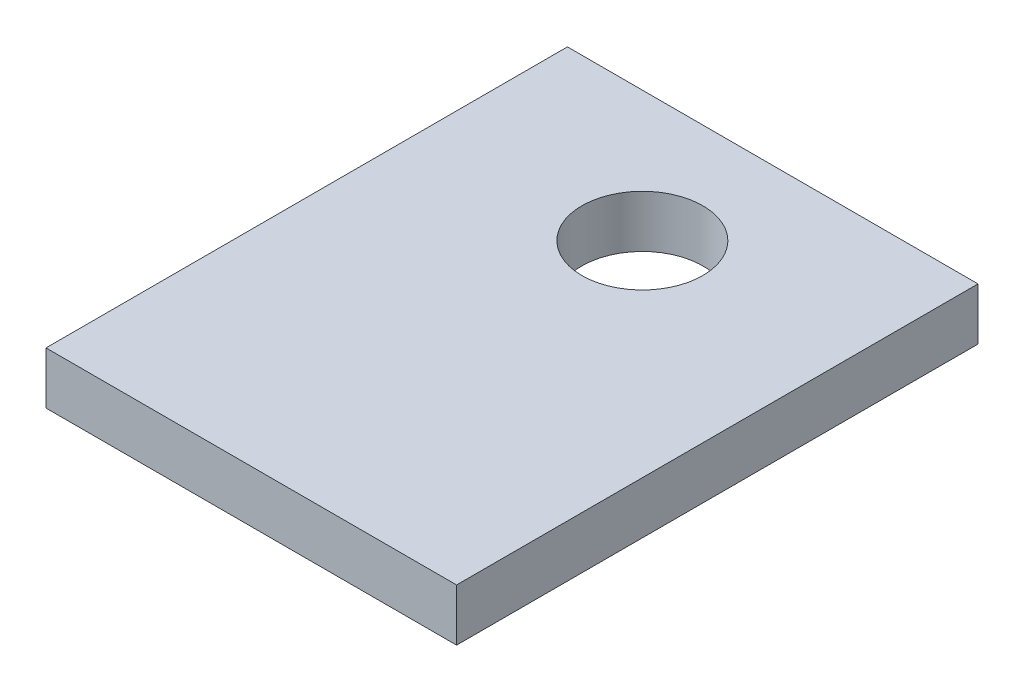
ISO-10303-21;
HEADER;
FILE_DESCRIPTION(('STEP AP214'),'2;1');
FILE_NAME('part.step','',(''),(''),'','','');
FILE_SCHEMA(('AUTOMOTIVE_DESIGN { 1 0 10303 214 1 1 1 1 }'));
ENDSEC;
DATA;
#1=APPLICATION_CONTEXT('core data for automotive mechanical design processes');
#2=APPLICATION_PROTOCOL_DEFINITION('international standard','automotive_design',2000,#1);
#3=PRODUCT_CONTEXT('',#1,'mechanical');
#4=PRODUCT('Part','Part','',(#3));
#5=PRODUCT_RELATED_PRODUCT_CATEGORY('part','',(#4));
#6=PRODUCT_DEFINITION_FORMATION('','',#4);
#7=PRODUCT_DEFINITION_CONTEXT('part definition',#1,'design');
#8=PRODUCT_DEFINITION('design','',#6,#7);
#9=PRODUCT_DEFINITION_SHAPE('','',#8);
#10=(LENGTH_UNIT() NAMED_UNIT(*) SI_UNIT(.MILLI.,.METRE.));
#11=(NAMED_UNIT(*) PLANE_ANGLE_UNIT() SI_UNIT($,.RADIAN.));
#12=(NAMED_UNIT(*) SI_UNIT($,.STERADIAN.) SOLID_ANGLE_UNIT());
#13=UNCERTAINTY_MEASURE_WITH_UNIT(LENGTH_MEASURE(1.E-05),#10,'distance_accuracy_value','');
#14=(GEOMETRIC_REPRESENTATION_CONTEXT(3) GLOBAL_UNCERTAINTY_ASSIGNED_CONTEXT((#13)) GLOBAL_UNIT_ASSIGNED_CONTEXT((#10,
#11,#12)) REPRESENTATION_CONTEXT('',''));
#15=CARTESIAN_POINT('',(0.,0.,0.));
#16=DIRECTION('',(0.,0.,1.));
#17=DIRECTION('',(1.,0.,0.));
#18=AXIS2_PLACEMENT_3D('',#15,#16,#17);
#19=CARTESIAN_POINT('',(0.,1.27,0.));
#20=DIRECTION('',(0.,1.,0.));
#21=DIRECTION('',(0.,0.,1.));
#22=AXIS2_PLACEMENT_3D('',#19,#20,#21);
#23=PLANE('',#22);
#24=DIRECTION('',(0.,0.,1.));
#25=VECTOR('',#24,1.);
#26=CARTESIAN_POINT('',(0.,1.27,0.));
#27=LINE('',#26,#25);
#28=CARTESIAN_POINT('',(0.,1.27,0.));
#29=VERTEX_POINT('',#28);
#30=CARTESIAN_POINT('',(0.,1.27,12.7));
#31=VERTEX_POINT('',#30);
#32=EDGE_CURVE('E96',#29,#31,#27,.T.);
#33=ORIENTED_EDGE('',*,*,#32,.T.);
#34=DIRECTION('',(1.,0.,0.));
#35=VECTOR('',#34,1.);
#36=CARTESIAN_POINT('',(0.,1.27,12.7));
#37=LINE('',#36,#35);
#38=CARTESIAN_POINT('',(10.,1.27,12.7));
#39=VERTEX_POINT('',#38);
#40=EDGE_CURVE('E91',#31,#39,#37,.T.);
#41=ORIENTED_EDGE('',*,*,#40,.T.);
#42=DIRECTION('',(0.,0.,-1.));
#43=VECTOR('',#42,1.);
#44=CARTESIAN_POINT('',(10.,1.27,0.));
#45=LINE('',#44,#43);
#46=CARTESIAN_POINT('',(10.,1.27,0.));
#47=VERTEX_POINT('',#46);
#48=EDGE_CURVE('E94',#39,#47,#45,.T.);
#49=ORIENTED_EDGE('',*,*,#48,.T.);
#50=DIRECTION('',(-1.,0.,0.));
#51=VECTOR('',#50,1.);
#52=CARTESIAN_POINT('',(0.,1.27,0.));
#53=LINE('',#52,#51);
#54=EDGE_CURVE('E61',#47,#29,#53,.T.);
#55=ORIENTED_EDGE('',*,*,#54,.T.);
#56=EDGE_LOOP('',(#33,#41,#49,#55));
#57=FACE_BOUND('',#56,.T.);
#58=CARTESIAN_POINT('',(5.,1.27,3.175));
#59=DIRECTION('',(0.,1.,0.));
#60=DIRECTION('',(0.,0.,1.));
#61=AXIS2_PLACEMENT_3D('',#58,#59,#60);
#62=CIRCLE('',#61,1.4732);
#63=CARTESIAN_POINT('',(5.,1.27,4.6482));
#64=VERTEX_POINT('',#63);
#65=EDGE_CURVE('E116',#64,#64,#62,.T.);
#66=ORIENTED_EDGE('',*,*,#65,.F.);
#67=EDGE_LOOP('',(#66));
#68=FACE_BOUND('',#67,.T.);
#69=ADVANCED_FACE('F43',(#57,#68),#23,.T.);
#70=CARTESIAN_POINT('',(0.,0.,0.));
#71=DIRECTION('',(0.,1.,0.));
#72=DIRECTION('',(0.,0.,1.));
#73=AXIS2_PLACEMENT_3D('',#70,#71,#72);
#74=PLANE('',#73);
#75=DIRECTION('',(0.,0.,1.));
#76=VECTOR('',#75,1.);
#77=CARTESIAN_POINT('',(0.,0.,0.));
#78=LINE('',#77,#76);
#79=CARTESIAN_POINT('',(0.,0.,0.));
#80=VERTEX_POINT('',#79);
#81=CARTESIAN_POINT('',(0.,0.,12.7));
#82=VERTEX_POINT('',#81);
#83=EDGE_CURVE('E112',#80,#82,#78,.T.);
#84=ORIENTED_EDGE('',*,*,#83,.F.);
#85=DIRECTION('',(-1.,0.,0.));
#86=VECTOR('',#85,1.);
#87=CARTESIAN_POINT('',(0.,0.,0.));
#88=LINE('',#87,#86);
#89=CARTESIAN_POINT('',(10.,0.,0.));
#90=VERTEX_POINT('',#89);
#91=EDGE_CURVE('E84',#90,#80,#88,.T.);
#92=ORIENTED_EDGE('',*,*,#91,.F.);
#93=DIRECTION('',(0.,0.,-1.));
#94=VECTOR('',#93,1.);
#95=CARTESIAN_POINT('',(10.,0.,0.));
#96=LINE('',#95,#94);
#97=CARTESIAN_POINT('',(10.,0.,12.7));
#98=VERTEX_POINT('',#97);
#99=EDGE_CURVE('E78',#98,#90,#96,.T.);
#100=ORIENTED_EDGE('',*,*,#99,.F.);
#101=DIRECTION('',(1.,0.,0.));
#102=VECTOR('',#101,1.);
#103=CARTESIAN_POINT('',(0.,0.,12.7));
#104=LINE('',#103,#102);
#105=EDGE_CURVE('E101',#82,#98,#104,.T.);
#106=ORIENTED_EDGE('',*,*,#105,.F.);
#107=EDGE_LOOP('',(#84,#92,#100,#106));
#108=FACE_BOUND('',#107,.T.);
#109=CARTESIAN_POINT('',(5.,0.,3.175));
#110=DIRECTION('',(0.,1.,0.));
#111=DIRECTION('',(0.,0.,1.));
#112=AXIS2_PLACEMENT_3D('',#109,#110,#111);
#113=CIRCLE('',#112,1.4732);
#114=CARTESIAN_POINT('',(5.,0.,4.6482));
#115=VERTEX_POINT('',#114);
#116=EDGE_CURVE('E134',#115,#115,#113,.T.);
#117=ORIENTED_EDGE('',*,*,#116,.T.);
#118=EDGE_LOOP('',(#117));
#119=FACE_BOUND('',#118,.T.);
#120=ADVANCED_FACE('F129',(#108,#119),#74,.F.);
#121=CARTESIAN_POINT('',(0.,1.27,0.));
#122=DIRECTION('',(1.,0.,0.));
#123=DIRECTION('',(0.,0.,-1.));
#124=AXIS2_PLACEMENT_3D('',#121,#122,#123);
#125=PLANE('',#124);
#126=ORIENTED_EDGE('',*,*,#83,.T.);
#127=DIRECTION('',(0.,-1.,0.));
#128=VECTOR('',#127,1.);
#129=CARTESIAN_POINT('',(0.,1.27,12.7));
#130=LINE('',#129,#128);
#131=EDGE_CURVE('E11',#31,#82,#130,.T.);
#132=ORIENTED_EDGE('',*,*,#131,.F.);
#133=ORIENTED_EDGE('',*,*,#32,.F.);
#134=DIRECTION('',(0.,-1.,0.));
#135=VECTOR('',#134,1.);
#136=CARTESIAN_POINT('',(0.,1.27,0.));
#137=LINE('',#136,#135);
#138=EDGE_CURVE('E108',#29,#80,#137,.T.);
#139=ORIENTED_EDGE('',*,*,#138,.T.);
#140=EDGE_LOOP('',(#126,#132,#133,#139));
#141=FACE_BOUND('',#140,.T.);
#142=ADVANCED_FACE('F45',(#141),#125,.F.);
#143=CARTESIAN_POINT('',(0.,1.27,12.7));
#144=DIRECTION('',(0.,0.,-1.));
#145=DIRECTION('',(-1.,0.,0.));
#146=AXIS2_PLACEMENT_3D('',#143,#144,#145);
#147=PLANE('',#146);
#148=ORIENTED_EDGE('',*,*,#105,.T.);
#149=DIRECTION('',(0.,-1.,0.));
#150=VECTOR('',#149,1.);
#151=CARTESIAN_POINT('',(10.,1.27,12.7));
#152=LINE('',#151,#150);
#153=EDGE_CURVE('E53',#39,#98,#152,.T.);
#154=ORIENTED_EDGE('',*,*,#153,.F.);
#155=ORIENTED_EDGE('',*,*,#40,.F.);
#156=ORIENTED_EDGE('',*,*,#131,.T.);
#157=EDGE_LOOP('',(#148,#154,#155,#156));
#158=FACE_BOUND('',#157,.T.);
#159=ADVANCED_FACE('F100',(#158),#147,.F.);
#160=CARTESIAN_POINT('',(10.,1.27,0.));
#161=DIRECTION('',(-1.,0.,0.));
#162=DIRECTION('',(0.,0.,1.));
#163=AXIS2_PLACEMENT_3D('',#160,#161,#162);
#164=PLANE('',#163);
#165=ORIENTED_EDGE('',*,*,#99,.T.);
#166=DIRECTION('',(0.,-1.,0.));
#167=VECTOR('',#166,1.);
#168=CARTESIAN_POINT('',(10.,1.27,0.));
#169=LINE('',#168,#167);
#170=EDGE_CURVE('E103',#47,#90,#169,.T.);
#171=ORIENTED_EDGE('',*,*,#170,.F.);
#172=ORIENTED_EDGE('',*,*,#48,.F.);
#173=ORIENTED_EDGE('',*,*,#153,.T.);
#174=EDGE_LOOP('',(#165,#171,#172,#173));
#175=FACE_BOUND('',#174,.T.);
#176=ADVANCED_FACE('F104',(#175),#164,.F.);
#177=CARTESIAN_POINT('',(0.,1.27,0.));
#178=DIRECTION('',(0.,0.,1.));
#179=DIRECTION('',(1.,0.,0.));
#180=AXIS2_PLACEMENT_3D('',#177,#178,#179);
#181=PLANE('',#180);
#182=ORIENTED_EDGE('',*,*,#91,.T.);
#183=ORIENTED_EDGE('',*,*,#138,.F.);
#184=ORIENTED_EDGE('',*,*,#54,.F.);
#185=ORIENTED_EDGE('',*,*,#170,.T.);
#186=EDGE_LOOP('',(#182,#183,#184,#185));
#187=FACE_BOUND('',#186,.T.);
#188=ADVANCED_FACE('F126',(#187),#181,.F.);
#189=CARTESIAN_POINT('',(5.,1.27,3.175));
#190=DIRECTION('',(0.,-1.,0.));
#191=DIRECTION('',(0.,0.,-1.));
#192=AXIS2_PLACEMENT_3D('',#189,#190,#191);
#193=CYLINDRICAL_SURFACE('',#192,1.4732);
#194=ORIENTED_EDGE('',*,*,#65,.T.);
#195=EDGE_LOOP('',(#194));
#196=FACE_BOUND('',#195,.T.);
#197=ORIENTED_EDGE('',*,*,#116,.F.);
#198=EDGE_LOOP('',(#197));
#199=FACE_BOUND('',#198,.T.);
#200=ADVANCED_FACE('F142',(#196,#199),#193,.F.);
#201=CLOSED_SHELL('',(#69,#120,#142,#159,#176,#188,#200));
#202=MANIFOLD_SOLID_BREP('B2',#201);
#203=ADVANCED_BREP_SHAPE_REPRESENTATION('',(#18,#202),#14);
#204=SHAPE_DEFINITION_REPRESENTATION(#9,#203);
ENDSEC;
END-ISO-10303-21;
